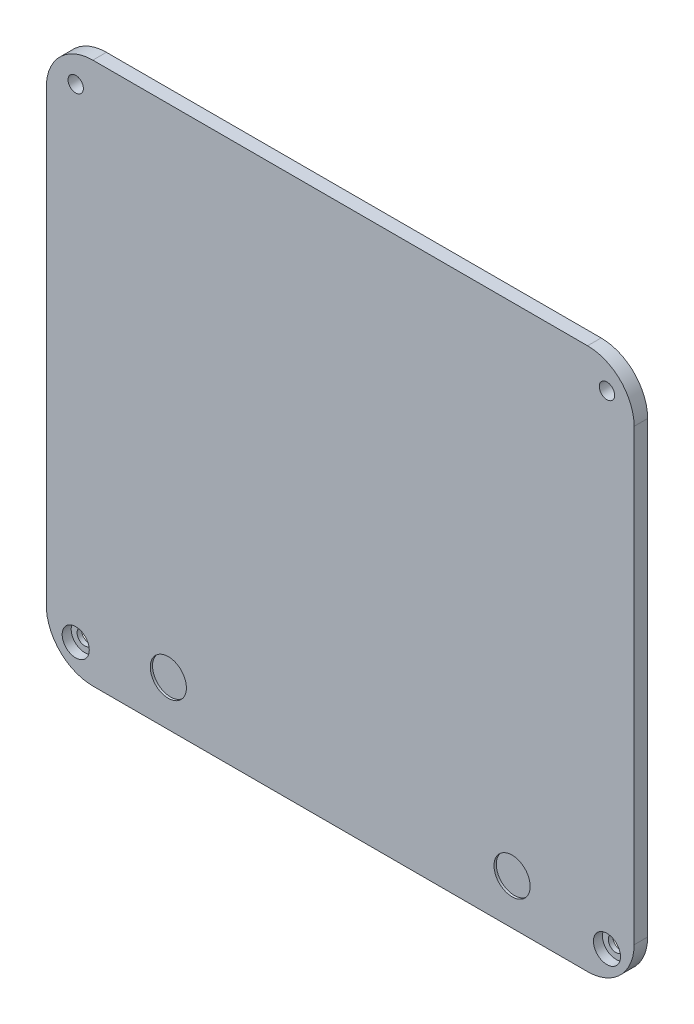
ISO-10303-21;
HEADER;
FILE_DESCRIPTION(('STEP AP214'),'2;1');
FILE_NAME('part.step','',(''),(''),'','','');
FILE_SCHEMA(('AUTOMOTIVE_DESIGN { 1 0 10303 214 1 1 1 1 }'));
ENDSEC;
DATA;
#1=APPLICATION_CONTEXT('core data for automotive mechanical design processes');
#2=APPLICATION_PROTOCOL_DEFINITION('international standard','automotive_design',2000,#1);
#3=PRODUCT_CONTEXT('',#1,'mechanical');
#4=PRODUCT('Part','Part','',(#3));
#5=PRODUCT_RELATED_PRODUCT_CATEGORY('part','',(#4));
#6=PRODUCT_DEFINITION_FORMATION('','',#4);
#7=PRODUCT_DEFINITION_CONTEXT('part definition',#1,'design');
#8=PRODUCT_DEFINITION('design','',#6,#7);
#9=PRODUCT_DEFINITION_SHAPE('','',#8);
#10=(LENGTH_UNIT() NAMED_UNIT(*) SI_UNIT(.MILLI.,.METRE.));
#11=(NAMED_UNIT(*) PLANE_ANGLE_UNIT() SI_UNIT($,.RADIAN.));
#12=(NAMED_UNIT(*) SI_UNIT($,.STERADIAN.) SOLID_ANGLE_UNIT());
#13=UNCERTAINTY_MEASURE_WITH_UNIT(LENGTH_MEASURE(1.E-05),#10,'distance_accuracy_value','');
#14=(GEOMETRIC_REPRESENTATION_CONTEXT(3) GLOBAL_UNCERTAINTY_ASSIGNED_CONTEXT((#13)) GLOBAL_UNIT_ASSIGNED_CONTEXT((#10,
#11,#12)) REPRESENTATION_CONTEXT('',''));
#15=CARTESIAN_POINT('',(0.,0.,0.));
#16=DIRECTION('',(0.,0.,1.));
#17=DIRECTION('',(1.,0.,0.));
#18=AXIS2_PLACEMENT_3D('',#15,#16,#17);
#19=CARTESIAN_POINT('',(-172.847423140113,-155.0967,3.));
#20=DIRECTION('',(0.,0.,-1.));
#21=DIRECTION('',(-1.,0.,0.));
#22=AXIS2_PLACEMENT_3D('',#19,#20,#21);
#23=CYLINDRICAL_SURFACE('',#22,1.70000000000001);
#24=CARTESIAN_POINT('',(-172.847423140113,-155.0967,0.));
#25=DIRECTION('',(0.,0.,1.));
#26=DIRECTION('',(1.,0.,0.));
#27=AXIS2_PLACEMENT_3D('',#24,#25,#26);
#28=CIRCLE('',#27,1.70000000000001);
#29=CARTESIAN_POINT('',(-171.147423140113,-155.0967,0.));
#30=VERTEX_POINT('',#29);
#31=EDGE_CURVE('E141',#30,#30,#28,.T.);
#32=ORIENTED_EDGE('',*,*,#31,.F.);
#33=EDGE_LOOP('',(#32));
#34=FACE_BOUND('',#33,.T.);
#35=CARTESIAN_POINT('',(-172.847423140113,-155.0967,1.));
#36=DIRECTION('',(0.,0.,1.));
#37=DIRECTION('',(1.,0.,0.));
#38=AXIS2_PLACEMENT_3D('',#35,#36,#37);
#39=CIRCLE('',#38,1.70000000000001);
#40=CARTESIAN_POINT('',(-171.147423140113,-155.0967,1.));
#41=VERTEX_POINT('',#40);
#42=EDGE_CURVE('E41',#41,#41,#39,.T.);
#43=ORIENTED_EDGE('',*,*,#42,.T.);
#44=EDGE_LOOP('',(#43));
#45=FACE_BOUND('',#44,.T.);
#46=ADVANCED_FACE('F37',(#34,#45),#23,.F.);
#47=CARTESIAN_POINT('',(-55.2338,-155.0967,3.));
#48=DIRECTION('',(0.,0.,-1.));
#49=DIRECTION('',(-1.,0.,0.));
#50=AXIS2_PLACEMENT_3D('',#47,#48,#49);
#51=CYLINDRICAL_SURFACE('',#50,1.7);
#52=CARTESIAN_POINT('',(-55.2338,-155.0967,0.));
#53=DIRECTION('',(0.,0.,1.));
#54=DIRECTION('',(1.,0.,0.));
#55=AXIS2_PLACEMENT_3D('',#52,#53,#54);
#56=CIRCLE('',#55,1.7);
#57=CARTESIAN_POINT('',(-53.5338,-155.0967,0.));
#58=VERTEX_POINT('',#57);
#59=EDGE_CURVE('E199',#58,#58,#56,.T.);
#60=ORIENTED_EDGE('',*,*,#59,.F.);
#61=EDGE_LOOP('',(#60));
#62=FACE_BOUND('',#61,.T.);
#63=CARTESIAN_POINT('',(-55.2338,-155.0967,1.));
#64=DIRECTION('',(0.,0.,1.));
#65=DIRECTION('',(1.,0.,0.));
#66=AXIS2_PLACEMENT_3D('',#63,#64,#65);
#67=CIRCLE('',#66,1.7);
#68=CARTESIAN_POINT('',(-53.5338,-155.0967,1.));
#69=VERTEX_POINT('',#68);
#70=EDGE_CURVE('E165',#69,#69,#67,.T.);
#71=ORIENTED_EDGE('',*,*,#70,.T.);
#72=EDGE_LOOP('',(#71));
#73=FACE_BOUND('',#72,.T.);
#74=ADVANCED_FACE('F245',(#62,#73),#51,.F.);
#75=CARTESIAN_POINT('',(-59.5275,-151.2967,3.));
#76=DIRECTION('',(0.,0.,1.));
#77=DIRECTION('',(1.,0.,0.));
#78=AXIS2_PLACEMENT_3D('',#75,#76,#77);
#79=PLANE('',#78);
#80=CARTESIAN_POINT('',(-152.347423140113,-151.5967,3.));
#81=DIRECTION('',(0.,0.,1.));
#82=DIRECTION('',(1.,0.,0.));
#83=AXIS2_PLACEMENT_3D('',#80,#81,#82);
#84=CIRCLE('',#83,3.99999999999999);
#85=CARTESIAN_POINT('',(-148.347423140113,-151.5967,3.));
#86=VERTEX_POINT('',#85);
#87=EDGE_CURVE('E400',#86,#86,#84,.T.);
#88=ORIENTED_EDGE('',*,*,#87,.F.);
#89=EDGE_LOOP('',(#88));
#90=FACE_BOUND('',#89,.T.);
#91=CARTESIAN_POINT('',(-76.2381768598874,-151.5967,3.));
#92=DIRECTION('',(0.,0.,1.));
#93=DIRECTION('',(-1.,0.,0.));
#94=AXIS2_PLACEMENT_3D('',#91,#92,#93);
#95=CIRCLE('',#94,3.99999999999999);
#96=CARTESIAN_POINT('',(-80.2381768598874,-151.5967,3.));
#97=VERTEX_POINT('',#96);
#98=EDGE_CURVE('E181',#97,#97,#95,.T.);
#99=ORIENTED_EDGE('',*,*,#98,.F.);
#100=EDGE_LOOP('',(#99));
#101=FACE_BOUND('',#100,.T.);
#102=CARTESIAN_POINT('',(-172.847423140113,-155.0967,3.));
#103=DIRECTION('',(0.,0.,1.));
#104=DIRECTION('',(1.,0.,0.));
#105=AXIS2_PLACEMENT_3D('',#102,#103,#104);
#106=CIRCLE('',#105,2.99999999999999);
#107=CARTESIAN_POINT('',(-169.847423140113,-155.0967,3.));
#108=VERTEX_POINT('',#107);
#109=EDGE_CURVE('E173',#108,#108,#106,.T.);
#110=ORIENTED_EDGE('',*,*,#109,.F.);
#111=EDGE_LOOP('',(#110));
#112=FACE_BOUND('',#111,.T.);
#113=CARTESIAN_POINT('',(-55.2338,-155.0967,3.));
#114=DIRECTION('',(0.,0.,1.));
#115=DIRECTION('',(1.,0.,0.));
#116=AXIS2_PLACEMENT_3D('',#113,#114,#115);
#117=CIRCLE('',#116,3.);
#118=CARTESIAN_POINT('',(-52.2338,-155.0967,3.));
#119=VERTEX_POINT('',#118);
#120=EDGE_CURVE('E186',#119,#119,#117,.T.);
#121=ORIENTED_EDGE('',*,*,#120,.F.);
#122=EDGE_LOOP('',(#121));
#123=FACE_BOUND('',#122,.T.);
#124=CARTESIAN_POINT('',(-55.2338,-48.0905,3.));
#125=DIRECTION('',(0.,0.,1.));
#126=DIRECTION('',(1.,0.,0.));
#127=AXIS2_PLACEMENT_3D('',#124,#125,#126);
#128=CIRCLE('',#127,1.7);
#129=CARTESIAN_POINT('',(-53.5338,-48.0905,3.));
#130=VERTEX_POINT('',#129);
#131=EDGE_CURVE('E196',#130,#130,#128,.T.);
#132=ORIENTED_EDGE('',*,*,#131,.F.);
#133=EDGE_LOOP('',(#132));
#134=FACE_BOUND('',#133,.T.);
#135=CARTESIAN_POINT('',(-59.5275,-151.2967,3.));
#136=DIRECTION('',(0.,0.,1.));
#137=DIRECTION('',(1.,0.,0.));
#138=AXIS2_PLACEMENT_3D('',#135,#136,#137);
#139=CIRCLE('',#138,10.3);
#140=CARTESIAN_POINT('',(-59.5275,-161.5967,3.));
#141=VERTEX_POINT('',#140);
#142=CARTESIAN_POINT('',(-49.2275,-151.2967,3.));
#143=VERTEX_POINT('',#142);
#144=EDGE_CURVE('E154',#141,#143,#139,.T.);
#145=ORIENTED_EDGE('',*,*,#144,.T.);
#146=DIRECTION('',(0.,1.,0.));
#147=VECTOR('',#146,1.);
#148=CARTESIAN_POINT('',(-49.2275,-151.2967,3.));
#149=LINE('',#148,#147);
#150=CARTESIAN_POINT('',(-49.2275,-51.8905,3.));
#151=VERTEX_POINT('',#150);
#152=EDGE_CURVE('E99',#143,#151,#149,.T.);
#153=ORIENTED_EDGE('',*,*,#152,.T.);
#154=CARTESIAN_POINT('',(-59.5275,-51.8905,3.));
#155=DIRECTION('',(0.,0.,1.));
#156=DIRECTION('',(1.,0.,0.));
#157=AXIS2_PLACEMENT_3D('',#154,#155,#156);
#158=CIRCLE('',#157,10.3);
#159=CARTESIAN_POINT('',(-59.5275,-41.5905,3.));
#160=VERTEX_POINT('',#159);
#161=EDGE_CURVE('E209',#151,#160,#158,.T.);
#162=ORIENTED_EDGE('',*,*,#161,.T.);
#163=DIRECTION('',(-1.,0.,0.));
#164=VECTOR('',#163,1.);
#165=CARTESIAN_POINT('',(-59.5275,-41.5905,3.));
#166=LINE('',#165,#164);
#167=CARTESIAN_POINT('',(-169.0581,-41.5905,3.));
#168=VERTEX_POINT('',#167);
#169=EDGE_CURVE('E211',#160,#168,#166,.T.);
#170=ORIENTED_EDGE('',*,*,#169,.T.);
#171=CARTESIAN_POINT('',(-169.0581,-51.8916076077553,3.));
#172=DIRECTION('',(0.,0.,1.));
#173=DIRECTION('',(1.,0.,0.));
#174=AXIS2_PLACEMENT_3D('',#171,#172,#173);
#175=CIRCLE('',#174,10.3011076077553);
#176=CARTESIAN_POINT('',(-179.347423140113,-52.3842,3.));
#177=VERTEX_POINT('',#176);
#178=EDGE_CURVE('E119',#168,#177,#175,.T.);
#179=ORIENTED_EDGE('',*,*,#178,.T.);
#180=DIRECTION('',(0.,-1.,0.));
#181=VECTOR('',#180,1.);
#182=CARTESIAN_POINT('',(-179.347423140113,-52.3842,3.));
#183=LINE('',#182,#181);
#184=CARTESIAN_POINT('',(-179.347423140113,-150.803560265838,3.));
#185=VERTEX_POINT('',#184);
#186=EDGE_CURVE('E112',#177,#185,#183,.T.);
#187=ORIENTED_EDGE('',*,*,#186,.T.);
#188=CARTESIAN_POINT('',(-169.0581,-151.295617947898,3.));
#189=DIRECTION('',(0.,0.,1.));
#190=DIRECTION('',(1.,0.,0.));
#191=AXIS2_PLACEMENT_3D('',#188,#189,#190);
#192=CIRCLE('',#191,10.3010820521017);
#193=CARTESIAN_POINT('',(-169.0581,-161.5967,3.));
#194=VERTEX_POINT('',#193);
#195=EDGE_CURVE('E117',#185,#194,#192,.T.);
#196=ORIENTED_EDGE('',*,*,#195,.T.);
#197=DIRECTION('',(1.,0.,0.));
#198=VECTOR('',#197,1.);
#199=CARTESIAN_POINT('',(-169.0581,-161.5967,3.));
#200=LINE('',#199,#198);
#201=EDGE_CURVE('E56',#194,#141,#200,.T.);
#202=ORIENTED_EDGE('',*,*,#201,.T.);
#203=EDGE_LOOP('',(#145,#153,#162,#170,#179,#187,#196,#202));
#204=FACE_BOUND('',#203,.T.);
#205=CARTESIAN_POINT('',(-172.847423140113,-48.0905,3.));
#206=DIRECTION('',(0.,0.,1.));
#207=DIRECTION('',(1.,0.,0.));
#208=AXIS2_PLACEMENT_3D('',#205,#206,#207);
#209=CIRCLE('',#208,1.70000000000001);
#210=CARTESIAN_POINT('',(-171.147423140113,-48.0905,3.));
#211=VERTEX_POINT('',#210);
#212=EDGE_CURVE('E190',#211,#211,#209,.T.);
#213=ORIENTED_EDGE('',*,*,#212,.F.);
#214=EDGE_LOOP('',(#213));
#215=FACE_BOUND('',#214,.T.);
#216=ADVANCED_FACE('F114',(#90,#101,#112,#123,#134,#204,#215),#79,.T.);
#217=CARTESIAN_POINT('',(-59.5275,-151.2967,0.));
#218=DIRECTION('',(0.,0.,1.));
#219=DIRECTION('',(1.,0.,0.));
#220=AXIS2_PLACEMENT_3D('',#217,#218,#219);
#221=PLANE('',#220);
#222=CARTESIAN_POINT('',(-59.5275,-151.2967,0.));
#223=DIRECTION('',(0.,0.,1.));
#224=DIRECTION('',(1.,0.,0.));
#225=AXIS2_PLACEMENT_3D('',#222,#223,#224);
#226=CIRCLE('',#225,10.3);
#227=CARTESIAN_POINT('',(-59.5275,-161.5967,0.));
#228=VERTEX_POINT('',#227);
#229=CARTESIAN_POINT('',(-49.2275,-151.2967,0.));
#230=VERTEX_POINT('',#229);
#231=EDGE_CURVE('E137',#228,#230,#226,.T.);
#232=ORIENTED_EDGE('',*,*,#231,.F.);
#233=DIRECTION('',(1.,0.,0.));
#234=VECTOR('',#233,1.);
#235=CARTESIAN_POINT('',(-169.0581,-161.5967,0.));
#236=LINE('',#235,#234);
#237=CARTESIAN_POINT('',(-169.0581,-161.5967,0.));
#238=VERTEX_POINT('',#237);
#239=EDGE_CURVE('E91',#238,#228,#236,.T.);
#240=ORIENTED_EDGE('',*,*,#239,.F.);
#241=CARTESIAN_POINT('',(-169.0581,-151.295617947898,0.));
#242=DIRECTION('',(0.,0.,1.));
#243=DIRECTION('',(1.,0.,0.));
#244=AXIS2_PLACEMENT_3D('',#241,#242,#243);
#245=CIRCLE('',#244,10.3010820521017);
#246=CARTESIAN_POINT('',(-179.347423140113,-150.803560265838,0.));
#247=VERTEX_POINT('',#246);
#248=EDGE_CURVE('E85',#247,#238,#245,.T.);
#249=ORIENTED_EDGE('',*,*,#248,.F.);
#250=DIRECTION('',(0.,-1.,0.));
#251=VECTOR('',#250,1.);
#252=CARTESIAN_POINT('',(-179.347423140113,-52.3842,0.));
#253=LINE('',#252,#251);
#254=CARTESIAN_POINT('',(-179.347423140113,-52.3842,0.));
#255=VERTEX_POINT('',#254);
#256=EDGE_CURVE('E127',#255,#247,#253,.T.);
#257=ORIENTED_EDGE('',*,*,#256,.F.);
#258=CARTESIAN_POINT('',(-169.0581,-51.8916076077553,0.));
#259=DIRECTION('',(0.,0.,1.));
#260=DIRECTION('',(1.,0.,0.));
#261=AXIS2_PLACEMENT_3D('',#258,#259,#260);
#262=CIRCLE('',#261,10.3011076077553);
#263=CARTESIAN_POINT('',(-169.0581,-41.5905,0.));
#264=VERTEX_POINT('',#263);
#265=EDGE_CURVE('E149',#264,#255,#262,.T.);
#266=ORIENTED_EDGE('',*,*,#265,.F.);
#267=DIRECTION('',(-1.,0.,0.));
#268=VECTOR('',#267,1.);
#269=CARTESIAN_POINT('',(-59.5275,-41.5905,0.));
#270=LINE('',#269,#268);
#271=CARTESIAN_POINT('',(-59.5275,-41.5905,0.));
#272=VERTEX_POINT('',#271);
#273=EDGE_CURVE('E146',#272,#264,#270,.T.);
#274=ORIENTED_EDGE('',*,*,#273,.F.);
#275=CARTESIAN_POINT('',(-59.5275,-51.8905,0.));
#276=DIRECTION('',(0.,0.,1.));
#277=DIRECTION('',(1.,0.,0.));
#278=AXIS2_PLACEMENT_3D('',#275,#276,#277);
#279=CIRCLE('',#278,10.3);
#280=CARTESIAN_POINT('',(-49.2275,-51.8905,0.));
#281=VERTEX_POINT('',#280);
#282=EDGE_CURVE('E144',#281,#272,#279,.T.);
#283=ORIENTED_EDGE('',*,*,#282,.F.);
#284=DIRECTION('',(0.,1.,0.));
#285=VECTOR('',#284,1.);
#286=CARTESIAN_POINT('',(-49.2275,-151.2967,0.));
#287=LINE('',#286,#285);
#288=EDGE_CURVE('E140',#230,#281,#287,.T.);
#289=ORIENTED_EDGE('',*,*,#288,.F.);
#290=EDGE_LOOP('',(#232,#240,#249,#257,#266,#274,#283,#289));
#291=FACE_BOUND('',#290,.T.);
#292=ORIENTED_EDGE('',*,*,#31,.T.);
#293=EDGE_LOOP('',(#292));
#294=FACE_BOUND('',#293,.T.);
#295=ORIENTED_EDGE('',*,*,#59,.T.);
#296=EDGE_LOOP('',(#295));
#297=FACE_BOUND('',#296,.T.);
#298=CARTESIAN_POINT('',(-55.2338,-48.0905,0.));
#299=DIRECTION('',(0.,0.,1.));
#300=DIRECTION('',(1.,0.,0.));
#301=AXIS2_PLACEMENT_3D('',#298,#299,#300);
#302=CIRCLE('',#301,1.7);
#303=CARTESIAN_POINT('',(-53.5338,-48.0905,0.));
#304=VERTEX_POINT('',#303);
#305=EDGE_CURVE('E193',#304,#304,#302,.T.);
#306=ORIENTED_EDGE('',*,*,#305,.T.);
#307=EDGE_LOOP('',(#306));
#308=FACE_BOUND('',#307,.T.);
#309=CARTESIAN_POINT('',(-172.847423140113,-48.0905,0.));
#310=DIRECTION('',(0.,0.,1.));
#311=DIRECTION('',(1.,0.,0.));
#312=AXIS2_PLACEMENT_3D('',#309,#310,#311);
#313=CIRCLE('',#312,1.70000000000001);
#314=CARTESIAN_POINT('',(-171.147423140113,-48.0905,0.));
#315=VERTEX_POINT('',#314);
#316=EDGE_CURVE('E171',#315,#315,#313,.T.);
#317=ORIENTED_EDGE('',*,*,#316,.T.);
#318=EDGE_LOOP('',(#317));
#319=FACE_BOUND('',#318,.T.);
#320=ADVANCED_FACE('F225',(#291,#294,#297,#308,#319),#221,.F.);
#321=CARTESIAN_POINT('',(-59.5275,-151.2967,3.));
#322=DIRECTION('',(0.,0.,-1.));
#323=DIRECTION('',(-1.,0.,0.));
#324=AXIS2_PLACEMENT_3D('',#321,#322,#323);
#325=CYLINDRICAL_SURFACE('',#324,10.3);
#326=ORIENTED_EDGE('',*,*,#231,.T.);
#327=DIRECTION('',(0.,0.,-1.));
#328=VECTOR('',#327,1.);
#329=CARTESIAN_POINT('',(-49.2275,-151.2967,3.));
#330=LINE('',#329,#328);
#331=EDGE_CURVE('E11',#143,#230,#330,.T.);
#332=ORIENTED_EDGE('',*,*,#331,.F.);
#333=ORIENTED_EDGE('',*,*,#144,.F.);
#334=DIRECTION('',(0.,0.,-1.));
#335=VECTOR('',#334,1.);
#336=CARTESIAN_POINT('',(-59.5275,-161.5967,3.));
#337=LINE('',#336,#335);
#338=EDGE_CURVE('E133',#141,#228,#337,.T.);
#339=ORIENTED_EDGE('',*,*,#338,.T.);
#340=EDGE_LOOP('',(#326,#332,#333,#339));
#341=FACE_BOUND('',#340,.T.);
#342=ADVANCED_FACE('F39',(#341),#325,.T.);
#343=CARTESIAN_POINT('',(-49.2275,-151.2967,3.));
#344=DIRECTION('',(-1.,0.,0.));
#345=DIRECTION('',(0.,0.,1.));
#346=AXIS2_PLACEMENT_3D('',#343,#344,#345);
#347=PLANE('',#346);
#348=ORIENTED_EDGE('',*,*,#288,.T.);
#349=DIRECTION('',(0.,0.,-1.));
#350=VECTOR('',#349,1.);
#351=CARTESIAN_POINT('',(-49.2275,-51.8905,3.));
#352=LINE('',#351,#350);
#353=EDGE_CURVE('E47',#151,#281,#352,.T.);
#354=ORIENTED_EDGE('',*,*,#353,.F.);
#355=ORIENTED_EDGE('',*,*,#152,.F.);
#356=ORIENTED_EDGE('',*,*,#331,.T.);
#357=EDGE_LOOP('',(#348,#354,#355,#356));
#358=FACE_BOUND('',#357,.T.);
#359=ADVANCED_FACE('F262',(#358),#347,.F.);
#360=CARTESIAN_POINT('',(-59.5275,-51.8905,3.));
#361=DIRECTION('',(0.,0.,-1.));
#362=DIRECTION('',(-1.,0.,0.));
#363=AXIS2_PLACEMENT_3D('',#360,#361,#362);
#364=CYLINDRICAL_SURFACE('',#363,10.3);
#365=ORIENTED_EDGE('',*,*,#282,.T.);
#366=DIRECTION('',(0.,0.,-1.));
#367=VECTOR('',#366,1.);
#368=CARTESIAN_POINT('',(-59.5275,-41.5905,3.));
#369=LINE('',#368,#367);
#370=EDGE_CURVE('E161',#160,#272,#369,.T.);
#371=ORIENTED_EDGE('',*,*,#370,.F.);
#372=ORIENTED_EDGE('',*,*,#161,.F.);
#373=ORIENTED_EDGE('',*,*,#353,.T.);
#374=EDGE_LOOP('',(#365,#371,#372,#373));
#375=FACE_BOUND('',#374,.T.);
#376=ADVANCED_FACE('F266',(#375),#364,.T.);
#377=CARTESIAN_POINT('',(-59.5275,-41.5905,3.));
#378=DIRECTION('',(0.,-1.,0.));
#379=DIRECTION('',(0.,0.,-1.));
#380=AXIS2_PLACEMENT_3D('',#377,#378,#379);
#381=PLANE('',#380);
#382=ORIENTED_EDGE('',*,*,#273,.T.);
#383=DIRECTION('',(0.,0.,-1.));
#384=VECTOR('',#383,1.);
#385=CARTESIAN_POINT('',(-169.0581,-41.5905,3.));
#386=LINE('',#385,#384);
#387=EDGE_CURVE('E158',#168,#264,#386,.T.);
#388=ORIENTED_EDGE('',*,*,#387,.F.);
#389=ORIENTED_EDGE('',*,*,#169,.F.);
#390=ORIENTED_EDGE('',*,*,#370,.T.);
#391=EDGE_LOOP('',(#382,#388,#389,#390));
#392=FACE_BOUND('',#391,.T.);
#393=ADVANCED_FACE('F218',(#392),#381,.F.);
#394=CARTESIAN_POINT('',(-169.0581,-51.8916076077553,3.));
#395=DIRECTION('',(0.,0.,-1.));
#396=DIRECTION('',(-1.,0.,0.));
#397=AXIS2_PLACEMENT_3D('',#394,#395,#396);
#398=CYLINDRICAL_SURFACE('',#397,10.3011076077553);
#399=ORIENTED_EDGE('',*,*,#265,.T.);
#400=DIRECTION('',(0.,0.,-1.));
#401=VECTOR('',#400,1.);
#402=CARTESIAN_POINT('',(-179.347423140113,-52.3842,3.));
#403=LINE('',#402,#401);
#404=EDGE_CURVE('E128',#177,#255,#403,.T.);
#405=ORIENTED_EDGE('',*,*,#404,.F.);
#406=ORIENTED_EDGE('',*,*,#178,.F.);
#407=ORIENTED_EDGE('',*,*,#387,.T.);
#408=EDGE_LOOP('',(#399,#405,#406,#407));
#409=FACE_BOUND('',#408,.T.);
#410=ADVANCED_FACE('F222',(#409),#398,.T.);
#411=CARTESIAN_POINT('',(-179.347423140113,-52.3842,3.));
#412=DIRECTION('',(1.,0.,0.));
#413=DIRECTION('',(0.,0.,-1.));
#414=AXIS2_PLACEMENT_3D('',#411,#412,#413);
#415=PLANE('',#414);
#416=ORIENTED_EDGE('',*,*,#256,.T.);
#417=DIRECTION('',(0.,0.,-1.));
#418=VECTOR('',#417,1.);
#419=CARTESIAN_POINT('',(-179.347423140113,-150.803560265838,3.));
#420=LINE('',#419,#418);
#421=EDGE_CURVE('E124',#185,#247,#420,.T.);
#422=ORIENTED_EDGE('',*,*,#421,.F.);
#423=ORIENTED_EDGE('',*,*,#186,.F.);
#424=ORIENTED_EDGE('',*,*,#404,.T.);
#425=EDGE_LOOP('',(#416,#422,#423,#424));
#426=FACE_BOUND('',#425,.T.);
#427=ADVANCED_FACE('F125',(#426),#415,.F.);
#428=CARTESIAN_POINT('',(-169.0581,-151.295617947898,3.));
#429=DIRECTION('',(0.,0.,-1.));
#430=DIRECTION('',(-1.,0.,0.));
#431=AXIS2_PLACEMENT_3D('',#428,#429,#430);
#432=CYLINDRICAL_SURFACE('',#431,10.3010820521017);
#433=ORIENTED_EDGE('',*,*,#248,.T.);
#434=DIRECTION('',(0.,0.,-1.));
#435=VECTOR('',#434,1.);
#436=CARTESIAN_POINT('',(-169.0581,-161.5967,3.));
#437=LINE('',#436,#435);
#438=EDGE_CURVE('E129',#194,#238,#437,.T.);
#439=ORIENTED_EDGE('',*,*,#438,.F.);
#440=ORIENTED_EDGE('',*,*,#195,.F.);
#441=ORIENTED_EDGE('',*,*,#421,.T.);
#442=EDGE_LOOP('',(#433,#439,#440,#441));
#443=FACE_BOUND('',#442,.T.);
#444=ADVANCED_FACE('F131',(#443),#432,.T.);
#445=CARTESIAN_POINT('',(-169.0581,-161.5967,3.));
#446=DIRECTION('',(0.,1.,0.));
#447=DIRECTION('',(0.,0.,1.));
#448=AXIS2_PLACEMENT_3D('',#445,#446,#447);
#449=PLANE('',#448);
#450=ORIENTED_EDGE('',*,*,#239,.T.);
#451=ORIENTED_EDGE('',*,*,#338,.F.);
#452=ORIENTED_EDGE('',*,*,#201,.F.);
#453=ORIENTED_EDGE('',*,*,#438,.T.);
#454=EDGE_LOOP('',(#450,#451,#452,#453));
#455=FACE_BOUND('',#454,.T.);
#456=ADVANCED_FACE('F231',(#455),#449,.F.);
#457=CARTESIAN_POINT('',(-55.2338,-48.0905,3.));
#458=DIRECTION('',(0.,0.,-1.));
#459=DIRECTION('',(-1.,0.,0.));
#460=AXIS2_PLACEMENT_3D('',#457,#458,#459);
#461=CYLINDRICAL_SURFACE('',#460,1.7);
#462=ORIENTED_EDGE('',*,*,#131,.T.);
#463=EDGE_LOOP('',(#462));
#464=FACE_BOUND('',#463,.T.);
#465=ORIENTED_EDGE('',*,*,#305,.F.);
#466=EDGE_LOOP('',(#465));
#467=FACE_BOUND('',#466,.T.);
#468=ADVANCED_FACE('F233',(#464,#467),#461,.F.);
#469=CARTESIAN_POINT('',(-172.847423140113,-48.0905,3.));
#470=DIRECTION('',(0.,0.,-1.));
#471=DIRECTION('',(-1.,0.,0.));
#472=AXIS2_PLACEMENT_3D('',#469,#470,#471);
#473=CYLINDRICAL_SURFACE('',#472,1.70000000000001);
#474=ORIENTED_EDGE('',*,*,#212,.T.);
#475=EDGE_LOOP('',(#474));
#476=FACE_BOUND('',#475,.T.);
#477=ORIENTED_EDGE('',*,*,#316,.F.);
#478=EDGE_LOOP('',(#477));
#479=FACE_BOUND('',#478,.T.);
#480=ADVANCED_FACE('F239',(#476,#479),#473,.F.);
#481=CARTESIAN_POINT('',(-55.2338,-155.0967,1.));
#482=DIRECTION('',(0.,0.,1.));
#483=DIRECTION('',(1.,0.,0.));
#484=AXIS2_PLACEMENT_3D('',#481,#482,#483);
#485=CYLINDRICAL_SURFACE('',#484,3.);
#486=CARTESIAN_POINT('',(-55.2338,-155.0967,1.));
#487=DIRECTION('',(0.,0.,1.));
#488=DIRECTION('',(1.,0.,0.));
#489=AXIS2_PLACEMENT_3D('',#486,#487,#488);
#490=CIRCLE('',#489,3.);
#491=CARTESIAN_POINT('',(-52.2338,-155.0967,1.));
#492=VERTEX_POINT('',#491);
#493=EDGE_CURVE('E178',#492,#492,#490,.T.);
#494=ORIENTED_EDGE('',*,*,#493,.F.);
#495=EDGE_LOOP('',(#494));
#496=FACE_BOUND('',#495,.T.);
#497=ORIENTED_EDGE('',*,*,#120,.T.);
#498=EDGE_LOOP('',(#497));
#499=FACE_BOUND('',#498,.T.);
#500=ADVANCED_FACE('F303',(#496,#499),#485,.F.);
#501=CARTESIAN_POINT('',(-55.2338,-155.0967,1.));
#502=DIRECTION('',(0.,0.,1.));
#503=DIRECTION('',(1.,0.,0.));
#504=AXIS2_PLACEMENT_3D('',#501,#502,#503);
#505=PLANE('',#504);
#506=ORIENTED_EDGE('',*,*,#70,.F.);
#507=EDGE_LOOP('',(#506));
#508=FACE_BOUND('',#507,.T.);
#509=ORIENTED_EDGE('',*,*,#493,.T.);
#510=EDGE_LOOP('',(#509));
#511=FACE_BOUND('',#510,.T.);
#512=ADVANCED_FACE('F323',(#508,#511),#505,.T.);
#513=CARTESIAN_POINT('',(-172.847423140113,-155.0967,1.));
#514=DIRECTION('',(0.,0.,1.));
#515=DIRECTION('',(1.,0.,0.));
#516=AXIS2_PLACEMENT_3D('',#513,#514,#515);
#517=CYLINDRICAL_SURFACE('',#516,2.99999999999999);
#518=CARTESIAN_POINT('',(-172.847423140113,-155.0967,1.));
#519=DIRECTION('',(0.,0.,1.));
#520=DIRECTION('',(1.,0.,0.));
#521=AXIS2_PLACEMENT_3D('',#518,#519,#520);
#522=CIRCLE('',#521,2.99999999999999);
#523=CARTESIAN_POINT('',(-169.847423140113,-155.0967,1.));
#524=VERTEX_POINT('',#523);
#525=EDGE_CURVE('E167',#524,#524,#522,.T.);
#526=ORIENTED_EDGE('',*,*,#525,.F.);
#527=EDGE_LOOP('',(#526));
#528=FACE_BOUND('',#527,.T.);
#529=ORIENTED_EDGE('',*,*,#109,.T.);
#530=EDGE_LOOP('',(#529));
#531=FACE_BOUND('',#530,.T.);
#532=ADVANCED_FACE('F330',(#528,#531),#517,.F.);
#533=CARTESIAN_POINT('',(-172.847423140113,-155.0967,1.));
#534=DIRECTION('',(0.,0.,1.));
#535=DIRECTION('',(1.,0.,0.));
#536=AXIS2_PLACEMENT_3D('',#533,#534,#535);
#537=PLANE('',#536);
#538=ORIENTED_EDGE('',*,*,#42,.F.);
#539=EDGE_LOOP('',(#538));
#540=FACE_BOUND('',#539,.T.);
#541=ORIENTED_EDGE('',*,*,#525,.T.);
#542=EDGE_LOOP('',(#541));
#543=FACE_BOUND('',#542,.T.);
#544=ADVANCED_FACE('F338',(#540,#543),#537,.T.);
#545=CARTESIAN_POINT('',(-76.2381768598874,-151.5967,2.5));
#546=DIRECTION('',(0.,0.,1.));
#547=DIRECTION('',(1.,0.,0.));
#548=AXIS2_PLACEMENT_3D('',#545,#546,#547);
#549=CYLINDRICAL_SURFACE('',#548,3.99999999999999);
#550=CARTESIAN_POINT('',(-76.2381768598874,-151.5967,2.5));
#551=DIRECTION('',(0.,0.,1.));
#552=DIRECTION('',(-1.,0.,0.));
#553=AXIS2_PLACEMENT_3D('',#550,#551,#552);
#554=CIRCLE('',#553,3.99999999999999);
#555=CARTESIAN_POINT('',(-80.2381768598874,-151.5967,2.5));
#556=VERTEX_POINT('',#555);
#557=EDGE_CURVE('E403',#556,#556,#554,.T.);
#558=ORIENTED_EDGE('',*,*,#557,.F.);
#559=EDGE_LOOP('',(#558));
#560=FACE_BOUND('',#559,.T.);
#561=ORIENTED_EDGE('',*,*,#98,.T.);
#562=EDGE_LOOP('',(#561));
#563=FACE_BOUND('',#562,.T.);
#564=ADVANCED_FACE('F346',(#560,#563),#549,.F.);
#565=CARTESIAN_POINT('',(-76.2381768598874,-151.5967,2.5));
#566=DIRECTION('',(0.,0.,-1.));
#567=DIRECTION('',(-1.,0.,0.));
#568=AXIS2_PLACEMENT_3D('',#565,#566,#567);
#569=PLANE('',#568);
#570=ORIENTED_EDGE('',*,*,#557,.T.);
#571=EDGE_LOOP('',(#570));
#572=FACE_BOUND('',#571,.T.);
#573=ADVANCED_FACE('F355',(#572),#569,.F.);
#574=CARTESIAN_POINT('',(-152.347423140113,-151.5967,2.5));
#575=DIRECTION('',(0.,0.,1.));
#576=DIRECTION('',(1.,0.,0.));
#577=AXIS2_PLACEMENT_3D('',#574,#575,#576);
#578=CYLINDRICAL_SURFACE('',#577,3.99999999999999);
#579=CARTESIAN_POINT('',(-152.347423140113,-151.5967,2.5));
#580=DIRECTION('',(0.,0.,1.));
#581=DIRECTION('',(1.,0.,0.));
#582=AXIS2_PLACEMENT_3D('',#579,#580,#581);
#583=CIRCLE('',#582,3.99999999999999);
#584=CARTESIAN_POINT('',(-148.347423140113,-151.5967,2.5));
#585=VERTEX_POINT('',#584);
#586=EDGE_CURVE('E189',#585,#585,#583,.T.);
#587=ORIENTED_EDGE('',*,*,#586,.F.);
#588=EDGE_LOOP('',(#587));
#589=FACE_BOUND('',#588,.T.);
#590=ORIENTED_EDGE('',*,*,#87,.T.);
#591=EDGE_LOOP('',(#590));
#592=FACE_BOUND('',#591,.T.);
#593=ADVANCED_FACE('F363',(#589,#592),#578,.F.);
#594=CARTESIAN_POINT('',(-152.347423140113,-151.5967,2.5));
#595=DIRECTION('',(0.,0.,1.));
#596=DIRECTION('',(1.,0.,0.));
#597=AXIS2_PLACEMENT_3D('',#594,#595,#596);
#598=PLANE('',#597);
#599=ORIENTED_EDGE('',*,*,#586,.T.);
#600=EDGE_LOOP('',(#599));
#601=FACE_BOUND('',#600,.T.);
#602=ADVANCED_FACE('F371',(#601),#598,.T.);
#603=CLOSED_SHELL('',(#46,#74,#216,#320,#342,#359,#376,#393,#410,#427,#444,#456,#468,#480,#500,
#512,#532,#544,#564,#573,#593,#602));
#604=MANIFOLD_SOLID_BREP('B2',#603);
#605=ADVANCED_BREP_SHAPE_REPRESENTATION('',(#18,#604),#14);
#606=SHAPE_DEFINITION_REPRESENTATION(#9,#605);
ENDSEC;
END-ISO-10303-21;
